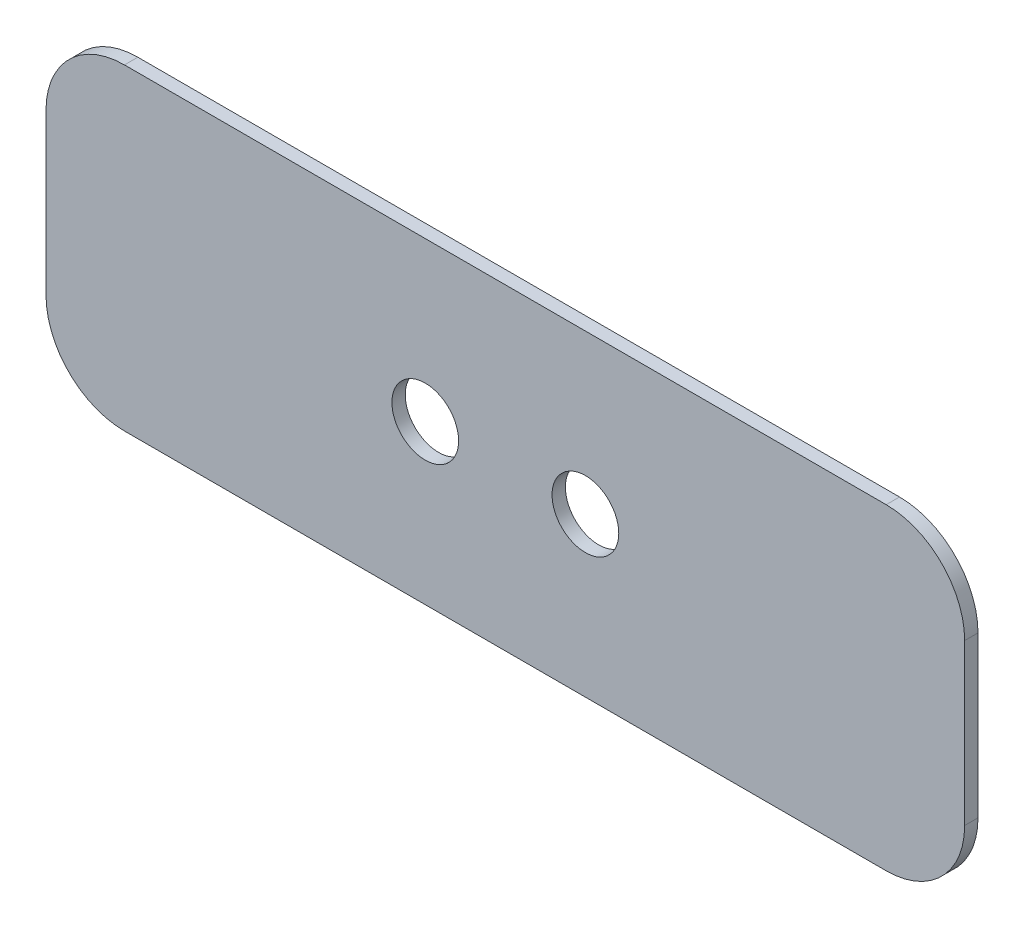
ISO-10303-21;
HEADER;
FILE_DESCRIPTION(('STEP AP214'),'2;1');
FILE_NAME('part.step','',(''),(''),'','','');
FILE_SCHEMA(('AUTOMOTIVE_DESIGN { 1 0 10303 214 1 1 1 1 }'));
ENDSEC;
DATA;
#1=APPLICATION_CONTEXT('core data for automotive mechanical design processes');
#2=APPLICATION_PROTOCOL_DEFINITION('international standard','automotive_design',2000,#1);
#3=PRODUCT_CONTEXT('',#1,'mechanical');
#4=PRODUCT('Part','Part','',(#3));
#5=PRODUCT_RELATED_PRODUCT_CATEGORY('part','',(#4));
#6=PRODUCT_DEFINITION_FORMATION('','',#4);
#7=PRODUCT_DEFINITION_CONTEXT('part definition',#1,'design');
#8=PRODUCT_DEFINITION('design','',#6,#7);
#9=PRODUCT_DEFINITION_SHAPE('','',#8);
#10=(LENGTH_UNIT() NAMED_UNIT(*) SI_UNIT(.MILLI.,.METRE.));
#11=(NAMED_UNIT(*) PLANE_ANGLE_UNIT() SI_UNIT($,.RADIAN.));
#12=(NAMED_UNIT(*) SI_UNIT($,.STERADIAN.) SOLID_ANGLE_UNIT());
#13=UNCERTAINTY_MEASURE_WITH_UNIT(LENGTH_MEASURE(1.E-05),#10,'distance_accuracy_value','');
#14=(GEOMETRIC_REPRESENTATION_CONTEXT(3) GLOBAL_UNCERTAINTY_ASSIGNED_CONTEXT((#13)) GLOBAL_UNIT_ASSIGNED_CONTEXT((#10,
#11,#12)) REPRESENTATION_CONTEXT('',''));
#15=CARTESIAN_POINT('',(0.,0.,0.));
#16=DIRECTION('',(0.,0.,1.));
#17=DIRECTION('',(1.,0.,0.));
#18=AXIS2_PLACEMENT_3D('',#15,#16,#17);
#19=CARTESIAN_POINT('',(181.225766336441,-180.975,6.35));
#20=DIRECTION('',(0.,0.,-1.));
#21=DIRECTION('',(-1.,0.,0.));
#22=AXIS2_PLACEMENT_3D('',#19,#20,#21);
#23=CYLINDRICAL_SURFACE('',#22,37.338);
#24=CARTESIAN_POINT('',(181.225766336441,-180.975,0.));
#25=DIRECTION('',(0.,0.,1.));
#26=DIRECTION('',(1.,0.,0.));
#27=AXIS2_PLACEMENT_3D('',#24,#25,#26);
#28=CIRCLE('',#27,37.338);
#29=CARTESIAN_POINT('',(181.225766336441,-218.313,0.));
#30=VERTEX_POINT('',#29);
#31=CARTESIAN_POINT('',(218.563766336441,-180.975,0.));
#32=VERTEX_POINT('',#31);
#33=EDGE_CURVE('E129',#30,#32,#28,.T.);
#34=ORIENTED_EDGE('',*,*,#33,.T.);
#35=DIRECTION('',(0.,0.,-1.));
#36=VECTOR('',#35,1.);
#37=CARTESIAN_POINT('',(218.563766336441,-180.975,6.35));
#38=LINE('',#37,#36);
#39=CARTESIAN_POINT('',(218.563766336441,-180.975,6.35));
#40=VERTEX_POINT('',#39);
#41=EDGE_CURVE('E11',#40,#32,#38,.T.);
#42=ORIENTED_EDGE('',*,*,#41,.F.);
#43=CARTESIAN_POINT('',(181.225766336441,-180.975,6.35));
#44=DIRECTION('',(0.,0.,1.));
#45=DIRECTION('',(1.,0.,0.));
#46=AXIS2_PLACEMENT_3D('',#43,#44,#45);
#47=CIRCLE('',#46,37.338);
#48=CARTESIAN_POINT('',(181.225766336441,-218.313,6.35));
#49=VERTEX_POINT('',#48);
#50=EDGE_CURVE('E144',#49,#40,#47,.T.);
#51=ORIENTED_EDGE('',*,*,#50,.F.);
#52=DIRECTION('',(0.,0.,-1.));
#53=VECTOR('',#52,1.);
#54=CARTESIAN_POINT('',(181.225766336441,-218.313,6.35));
#55=LINE('',#54,#53);
#56=EDGE_CURVE('E125',#49,#30,#55,.T.);
#57=ORIENTED_EDGE('',*,*,#56,.T.);
#58=EDGE_LOOP('',(#34,#42,#51,#57));
#59=FACE_BOUND('',#58,.T.);
#60=ADVANCED_FACE('F33',(#59),#23,.T.);
#61=CARTESIAN_POINT('',(218.563766336441,-180.975,6.35));
#62=DIRECTION('',(-1.,0.,0.));
#63=DIRECTION('',(0.,-1.,0.));
#64=AXIS2_PLACEMENT_3D('',#61,#62,#63);
#65=PLANE('',#64);
#66=DIRECTION('',(0.,1.,0.));
#67=VECTOR('',#66,1.);
#68=CARTESIAN_POINT('',(218.563766336441,-180.975,0.));
#69=LINE('',#68,#67);
#70=CARTESIAN_POINT('',(218.563766336441,-104.775,0.));
#71=VERTEX_POINT('',#70);
#72=EDGE_CURVE('E132',#32,#71,#69,.T.);
#73=ORIENTED_EDGE('',*,*,#72,.T.);
#74=DIRECTION('',(0.,0.,-1.));
#75=VECTOR('',#74,1.);
#76=CARTESIAN_POINT('',(218.563766336441,-104.775,6.35));
#77=LINE('',#76,#75);
#78=CARTESIAN_POINT('',(218.563766336441,-104.775,6.35));
#79=VERTEX_POINT('',#78);
#80=EDGE_CURVE('E41',#79,#71,#77,.T.);
#81=ORIENTED_EDGE('',*,*,#80,.F.);
#82=DIRECTION('',(0.,1.,0.));
#83=VECTOR('',#82,1.);
#84=CARTESIAN_POINT('',(218.563766336441,-180.975,6.35));
#85=LINE('',#84,#83);
#86=EDGE_CURVE('E92',#40,#79,#85,.T.);
#87=ORIENTED_EDGE('',*,*,#86,.F.);
#88=ORIENTED_EDGE('',*,*,#41,.T.);
#89=EDGE_LOOP('',(#73,#81,#87,#88));
#90=FACE_BOUND('',#89,.T.);
#91=ADVANCED_FACE('F212',(#90),#65,.F.);
#92=CARTESIAN_POINT('',(181.225766336441,-104.775,6.35));
#93=DIRECTION('',(0.,0.,-1.));
#94=DIRECTION('',(-1.,0.,0.));
#95=AXIS2_PLACEMENT_3D('',#92,#93,#94);
#96=CYLINDRICAL_SURFACE('',#95,37.338);
#97=CARTESIAN_POINT('',(181.225766336441,-104.775,0.));
#98=DIRECTION('',(0.,0.,1.));
#99=DIRECTION('',(1.,0.,0.));
#100=AXIS2_PLACEMENT_3D('',#97,#98,#99);
#101=CIRCLE('',#100,37.338);
#102=CARTESIAN_POINT('',(181.225766336441,-67.437,0.));
#103=VERTEX_POINT('',#102);
#104=EDGE_CURVE('E135',#71,#103,#101,.T.);
#105=ORIENTED_EDGE('',*,*,#104,.T.);
#106=DIRECTION('',(0.,0.,-1.));
#107=VECTOR('',#106,1.);
#108=CARTESIAN_POINT('',(181.225766336441,-67.437,6.35));
#109=LINE('',#108,#107);
#110=CARTESIAN_POINT('',(181.225766336441,-67.437,6.35));
#111=VERTEX_POINT('',#110);
#112=EDGE_CURVE('E151',#111,#103,#109,.T.);
#113=ORIENTED_EDGE('',*,*,#112,.F.);
#114=CARTESIAN_POINT('',(181.225766336441,-104.775,6.35));
#115=DIRECTION('',(0.,0.,1.));
#116=DIRECTION('',(1.,0.,0.));
#117=AXIS2_PLACEMENT_3D('',#114,#115,#116);
#118=CIRCLE('',#117,37.338);
#119=EDGE_CURVE('E159',#79,#111,#118,.T.);
#120=ORIENTED_EDGE('',*,*,#119,.F.);
#121=ORIENTED_EDGE('',*,*,#80,.T.);
#122=EDGE_LOOP('',(#105,#113,#120,#121));
#123=FACE_BOUND('',#122,.T.);
#124=ADVANCED_FACE('F157',(#123),#96,.T.);
#125=CARTESIAN_POINT('',(181.225766336441,-67.437,6.35));
#126=DIRECTION('',(0.,-1.,0.));
#127=DIRECTION('',(0.,0.,-1.));
#128=AXIS2_PLACEMENT_3D('',#125,#126,#127);
#129=PLANE('',#128);
#130=DIRECTION('',(-1.,0.,0.));
#131=VECTOR('',#130,1.);
#132=CARTESIAN_POINT('',(181.225766336441,-67.437,0.));
#133=LINE('',#132,#131);
#134=CARTESIAN_POINT('',(-181.225766336441,-67.437,0.));
#135=VERTEX_POINT('',#134);
#136=EDGE_CURVE('E137',#103,#135,#133,.T.);
#137=ORIENTED_EDGE('',*,*,#136,.T.);
#138=DIRECTION('',(0.,0.,-1.));
#139=VECTOR('',#138,1.);
#140=CARTESIAN_POINT('',(-181.225766336441,-67.437,6.35));
#141=LINE('',#140,#139);
#142=CARTESIAN_POINT('',(-181.225766336441,-67.437,6.35));
#143=VERTEX_POINT('',#142);
#144=EDGE_CURVE('E148',#143,#135,#141,.T.);
#145=ORIENTED_EDGE('',*,*,#144,.F.);
#146=DIRECTION('',(-1.,0.,0.));
#147=VECTOR('',#146,1.);
#148=CARTESIAN_POINT('',(181.225766336441,-67.437,6.35));
#149=LINE('',#148,#147);
#150=EDGE_CURVE('E171',#111,#143,#149,.T.);
#151=ORIENTED_EDGE('',*,*,#150,.F.);
#152=ORIENTED_EDGE('',*,*,#112,.T.);
#153=EDGE_LOOP('',(#137,#145,#151,#152));
#154=FACE_BOUND('',#153,.T.);
#155=ADVANCED_FACE('F167',(#154),#129,.F.);
#156=CARTESIAN_POINT('',(-181.225766336441,-104.775,6.35));
#157=DIRECTION('',(0.,0.,-1.));
#158=DIRECTION('',(-1.,0.,0.));
#159=AXIS2_PLACEMENT_3D('',#156,#157,#158);
#160=CYLINDRICAL_SURFACE('',#159,37.338);
#161=CARTESIAN_POINT('',(-181.225766336441,-104.775,0.));
#162=DIRECTION('',(0.,0.,1.));
#163=DIRECTION('',(1.,0.,0.));
#164=AXIS2_PLACEMENT_3D('',#161,#162,#163);
#165=CIRCLE('',#164,37.338);
#166=CARTESIAN_POINT('',(-218.563766336441,-104.775,0.));
#167=VERTEX_POINT('',#166);
#168=EDGE_CURVE('E139',#135,#167,#165,.T.);
#169=ORIENTED_EDGE('',*,*,#168,.T.);
#170=DIRECTION('',(0.,0.,-1.));
#171=VECTOR('',#170,1.);
#172=CARTESIAN_POINT('',(-218.563766336441,-104.775,6.35));
#173=LINE('',#172,#171);
#174=CARTESIAN_POINT('',(-218.563766336441,-104.775,6.35));
#175=VERTEX_POINT('',#174);
#176=EDGE_CURVE('E120',#175,#167,#173,.T.);
#177=ORIENTED_EDGE('',*,*,#176,.F.);
#178=CARTESIAN_POINT('',(-181.225766336441,-104.775,6.35));
#179=DIRECTION('',(0.,0.,1.));
#180=DIRECTION('',(1.,0.,0.));
#181=AXIS2_PLACEMENT_3D('',#178,#179,#180);
#182=CIRCLE('',#181,37.338);
#183=EDGE_CURVE('E111',#143,#175,#182,.T.);
#184=ORIENTED_EDGE('',*,*,#183,.F.);
#185=ORIENTED_EDGE('',*,*,#144,.T.);
#186=EDGE_LOOP('',(#169,#177,#184,#185));
#187=FACE_BOUND('',#186,.T.);
#188=ADVANCED_FACE('F170',(#187),#160,.T.);
#189=CARTESIAN_POINT('',(-218.563766336441,-104.775,6.35));
#190=DIRECTION('',(1.,0.,0.));
#191=DIRECTION('',(0.,1.,0.));
#192=AXIS2_PLACEMENT_3D('',#189,#190,#191);
#193=PLANE('',#192);
#194=DIRECTION('',(0.,-1.,0.));
#195=VECTOR('',#194,1.);
#196=CARTESIAN_POINT('',(-218.563766336441,-104.775,0.));
#197=LINE('',#196,#195);
#198=CARTESIAN_POINT('',(-218.563766336441,-180.975,0.));
#199=VERTEX_POINT('',#198);
#200=EDGE_CURVE('E119',#167,#199,#197,.T.);
#201=ORIENTED_EDGE('',*,*,#200,.T.);
#202=DIRECTION('',(0.,0.,-1.));
#203=VECTOR('',#202,1.);
#204=CARTESIAN_POINT('',(-218.563766336441,-180.975,6.35));
#205=LINE('',#204,#203);
#206=CARTESIAN_POINT('',(-218.563766336441,-180.975,6.35));
#207=VERTEX_POINT('',#206);
#208=EDGE_CURVE('E116',#207,#199,#205,.T.);
#209=ORIENTED_EDGE('',*,*,#208,.F.);
#210=DIRECTION('',(0.,-1.,0.));
#211=VECTOR('',#210,1.);
#212=CARTESIAN_POINT('',(-218.563766336441,-104.775,6.35));
#213=LINE('',#212,#211);
#214=EDGE_CURVE('E105',#175,#207,#213,.T.);
#215=ORIENTED_EDGE('',*,*,#214,.F.);
#216=ORIENTED_EDGE('',*,*,#176,.T.);
#217=EDGE_LOOP('',(#201,#209,#215,#216));
#218=FACE_BOUND('',#217,.T.);
#219=ADVANCED_FACE('F117',(#218),#193,.F.);
#220=CARTESIAN_POINT('',(-181.225766336441,-180.975,6.35));
#221=DIRECTION('',(0.,0.,-1.));
#222=DIRECTION('',(-1.,0.,0.));
#223=AXIS2_PLACEMENT_3D('',#220,#221,#222);
#224=CYLINDRICAL_SURFACE('',#223,37.338);
#225=CARTESIAN_POINT('',(-181.225766336441,-180.975,0.));
#226=DIRECTION('',(0.,0.,1.));
#227=DIRECTION('',(1.,0.,0.));
#228=AXIS2_PLACEMENT_3D('',#225,#226,#227);
#229=CIRCLE('',#228,37.338);
#230=CARTESIAN_POINT('',(-181.225766336441,-218.313,0.));
#231=VERTEX_POINT('',#230);
#232=EDGE_CURVE('E78',#199,#231,#229,.T.);
#233=ORIENTED_EDGE('',*,*,#232,.T.);
#234=DIRECTION('',(0.,0.,-1.));
#235=VECTOR('',#234,1.);
#236=CARTESIAN_POINT('',(-181.225766336441,-218.313,6.35));
#237=LINE('',#236,#235);
#238=CARTESIAN_POINT('',(-181.225766336441,-218.313,6.35));
#239=VERTEX_POINT('',#238);
#240=EDGE_CURVE('E121',#239,#231,#237,.T.);
#241=ORIENTED_EDGE('',*,*,#240,.F.);
#242=CARTESIAN_POINT('',(-181.225766336441,-180.975,6.35));
#243=DIRECTION('',(0.,0.,1.));
#244=DIRECTION('',(1.,0.,0.));
#245=AXIS2_PLACEMENT_3D('',#242,#243,#244);
#246=CIRCLE('',#245,37.338);
#247=EDGE_CURVE('E109',#207,#239,#246,.T.);
#248=ORIENTED_EDGE('',*,*,#247,.F.);
#249=ORIENTED_EDGE('',*,*,#208,.T.);
#250=EDGE_LOOP('',(#233,#241,#248,#249));
#251=FACE_BOUND('',#250,.T.);
#252=ADVANCED_FACE('F123',(#251),#224,.T.);
#253=CARTESIAN_POINT('',(-181.225766336441,-218.313,6.35));
#254=DIRECTION('',(0.,1.,0.));
#255=DIRECTION('',(0.,0.,1.));
#256=AXIS2_PLACEMENT_3D('',#253,#254,#255);
#257=PLANE('',#256);
#258=DIRECTION('',(1.,0.,0.));
#259=VECTOR('',#258,1.);
#260=CARTESIAN_POINT('',(-181.225766336441,-218.313,0.));
#261=LINE('',#260,#259);
#262=EDGE_CURVE('E84',#231,#30,#261,.T.);
#263=ORIENTED_EDGE('',*,*,#262,.T.);
#264=ORIENTED_EDGE('',*,*,#56,.F.);
#265=DIRECTION('',(1.,0.,0.));
#266=VECTOR('',#265,1.);
#267=CARTESIAN_POINT('',(-181.225766336441,-218.313,6.35));
#268=LINE('',#267,#266);
#269=EDGE_CURVE('E49',#239,#49,#268,.T.);
#270=ORIENTED_EDGE('',*,*,#269,.F.);
#271=ORIENTED_EDGE('',*,*,#240,.T.);
#272=EDGE_LOOP('',(#263,#264,#270,#271));
#273=FACE_BOUND('',#272,.T.);
#274=ADVANCED_FACE('F194',(#273),#257,.F.);
#275=CARTESIAN_POINT('',(181.225766336441,-180.975,6.35));
#276=DIRECTION('',(0.,0.,1.));
#277=DIRECTION('',(1.,0.,0.));
#278=AXIS2_PLACEMENT_3D('',#275,#276,#277);
#279=PLANE('',#278);
#280=CARTESIAN_POINT('',(-38.1,-142.875,6.35));
#281=DIRECTION('',(0.,0.,1.));
#282=DIRECTION('',(1.,0.,0.));
#283=AXIS2_PLACEMENT_3D('',#280,#281,#282);
#284=CIRCLE('',#283,15.875);
#285=CARTESIAN_POINT('',(-22.225,-142.875,6.35));
#286=VERTEX_POINT('',#285);
#287=EDGE_CURVE('E180',#286,#286,#284,.T.);
#288=ORIENTED_EDGE('',*,*,#287,.F.);
#289=EDGE_LOOP('',(#288));
#290=FACE_BOUND('',#289,.T.);
#291=CARTESIAN_POINT('',(38.1,-142.875,6.35));
#292=DIRECTION('',(0.,0.,1.));
#293=DIRECTION('',(1.,0.,0.));
#294=AXIS2_PLACEMENT_3D('',#291,#292,#293);
#295=CIRCLE('',#294,15.875);
#296=CARTESIAN_POINT('',(53.975,-142.875,6.35));
#297=VERTEX_POINT('',#296);
#298=EDGE_CURVE('E181',#297,#297,#295,.T.);
#299=ORIENTED_EDGE('',*,*,#298,.F.);
#300=EDGE_LOOP('',(#299));
#301=FACE_BOUND('',#300,.T.);
#302=ORIENTED_EDGE('',*,*,#50,.T.);
#303=ORIENTED_EDGE('',*,*,#86,.T.);
#304=ORIENTED_EDGE('',*,*,#119,.T.);
#305=ORIENTED_EDGE('',*,*,#150,.T.);
#306=ORIENTED_EDGE('',*,*,#183,.T.);
#307=ORIENTED_EDGE('',*,*,#214,.T.);
#308=ORIENTED_EDGE('',*,*,#247,.T.);
#309=ORIENTED_EDGE('',*,*,#269,.T.);
#310=EDGE_LOOP('',(#302,#303,#304,#305,#306,#307,#308,#309));
#311=FACE_BOUND('',#310,.T.);
#312=ADVANCED_FACE('F107',(#290,#301,#311),#279,.T.);
#313=CARTESIAN_POINT('',(181.225766336441,-180.975,0.));
#314=DIRECTION('',(0.,0.,1.));
#315=DIRECTION('',(1.,0.,0.));
#316=AXIS2_PLACEMENT_3D('',#313,#314,#315);
#317=PLANE('',#316);
#318=CARTESIAN_POINT('',(-38.1,-142.875,0.));
#319=DIRECTION('',(0.,0.,1.));
#320=DIRECTION('',(1.,0.,0.));
#321=AXIS2_PLACEMENT_3D('',#318,#319,#320);
#322=CIRCLE('',#321,15.875);
#323=CARTESIAN_POINT('',(-22.225,-142.875,0.));
#324=VERTEX_POINT('',#323);
#325=EDGE_CURVE('E133',#324,#324,#322,.F.);
#326=ORIENTED_EDGE('',*,*,#325,.F.);
#327=EDGE_LOOP('',(#326));
#328=FACE_BOUND('',#327,.T.);
#329=CARTESIAN_POINT('',(38.1,-142.875,0.));
#330=DIRECTION('',(0.,0.,1.));
#331=DIRECTION('',(1.,0.,0.));
#332=AXIS2_PLACEMENT_3D('',#329,#330,#331);
#333=CIRCLE('',#332,15.875);
#334=CARTESIAN_POINT('',(53.975,-142.875,0.));
#335=VERTEX_POINT('',#334);
#336=EDGE_CURVE('E177',#335,#335,#333,.F.);
#337=ORIENTED_EDGE('',*,*,#336,.F.);
#338=EDGE_LOOP('',(#337));
#339=FACE_BOUND('',#338,.T.);
#340=ORIENTED_EDGE('',*,*,#33,.F.);
#341=ORIENTED_EDGE('',*,*,#262,.F.);
#342=ORIENTED_EDGE('',*,*,#232,.F.);
#343=ORIENTED_EDGE('',*,*,#200,.F.);
#344=ORIENTED_EDGE('',*,*,#168,.F.);
#345=ORIENTED_EDGE('',*,*,#136,.F.);
#346=ORIENTED_EDGE('',*,*,#104,.F.);
#347=ORIENTED_EDGE('',*,*,#72,.F.);
#348=EDGE_LOOP('',(#340,#341,#342,#343,#344,#345,#346,#347));
#349=FACE_BOUND('',#348,.T.);
#350=ADVANCED_FACE('F163',(#328,#339,#349),#317,.F.);
#351=CARTESIAN_POINT('',(38.1,-142.875,-0.00100000000000013));
#352=DIRECTION('',(0.,0.,1.));
#353=DIRECTION('',(1.,0.,0.));
#354=AXIS2_PLACEMENT_3D('',#351,#352,#353);
#355=CYLINDRICAL_SURFACE('',#354,15.875);
#356=ORIENTED_EDGE('',*,*,#298,.T.);
#357=EDGE_LOOP('',(#356));
#358=FACE_BOUND('',#357,.T.);
#359=ORIENTED_EDGE('',*,*,#336,.T.);
#360=EDGE_LOOP('',(#359));
#361=FACE_BOUND('',#360,.T.);
#362=ADVANCED_FACE('F198',(#358,#361),#355,.F.);
#363=CARTESIAN_POINT('',(-38.1,-142.875,-0.00100000000000013));
#364=DIRECTION('',(0.,0.,1.));
#365=DIRECTION('',(1.,0.,0.));
#366=AXIS2_PLACEMENT_3D('',#363,#364,#365);
#367=CYLINDRICAL_SURFACE('',#366,15.875);
#368=ORIENTED_EDGE('',*,*,#287,.T.);
#369=EDGE_LOOP('',(#368));
#370=FACE_BOUND('',#369,.T.);
#371=ORIENTED_EDGE('',*,*,#325,.T.);
#372=EDGE_LOOP('',(#371));
#373=FACE_BOUND('',#372,.T.);
#374=ADVANCED_FACE('F189',(#370,#373),#367,.F.);
#375=CLOSED_SHELL('',(#60,#91,#124,#155,#188,#219,#252,#274,#312,#350,#362,#374));
#376=MANIFOLD_SOLID_BREP('B2',#375);
#377=ADVANCED_BREP_SHAPE_REPRESENTATION('',(#18,#376),#14);
#378=SHAPE_DEFINITION_REPRESENTATION(#9,#377);
ENDSEC;
END-ISO-10303-21;
